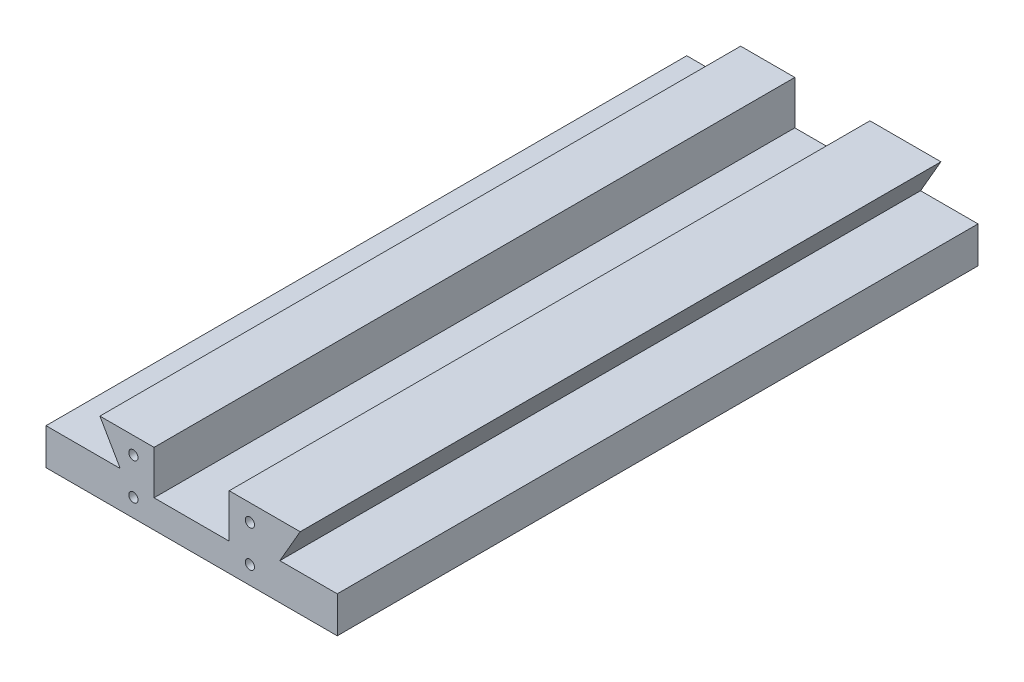
ISO-10303-21;
HEADER;
FILE_DESCRIPTION(('STEP AP214'),'2;1');
FILE_NAME('part.step','',(''),(''),'','','');
FILE_SCHEMA(('AUTOMOTIVE_DESIGN { 1 0 10303 214 1 1 1 1 }'));
ENDSEC;
DATA;
#1=APPLICATION_CONTEXT('core data for automotive mechanical design processes');
#2=APPLICATION_PROTOCOL_DEFINITION('international standard','automotive_design',2000,#1);
#3=PRODUCT_CONTEXT('',#1,'mechanical');
#4=PRODUCT('Part','Part','',(#3));
#5=PRODUCT_RELATED_PRODUCT_CATEGORY('part','',(#4));
#6=PRODUCT_DEFINITION_FORMATION('','',#4);
#7=PRODUCT_DEFINITION_CONTEXT('part definition',#1,'design');
#8=PRODUCT_DEFINITION('design','',#6,#7);
#9=PRODUCT_DEFINITION_SHAPE('','',#8);
#10=(LENGTH_UNIT() NAMED_UNIT(*) SI_UNIT(.MILLI.,.METRE.));
#11=(NAMED_UNIT(*) PLANE_ANGLE_UNIT() SI_UNIT($,.RADIAN.));
#12=(NAMED_UNIT(*) SI_UNIT($,.STERADIAN.) SOLID_ANGLE_UNIT());
#13=UNCERTAINTY_MEASURE_WITH_UNIT(LENGTH_MEASURE(1.E-05),#10,'distance_accuracy_value','');
#14=(GEOMETRIC_REPRESENTATION_CONTEXT(3) GLOBAL_UNCERTAINTY_ASSIGNED_CONTEXT((#13)) GLOBAL_UNIT_ASSIGNED_CONTEXT((#10,
#11,#12)) REPRESENTATION_CONTEXT('',''));
#15=CARTESIAN_POINT('',(0.,0.,0.));
#16=DIRECTION('',(0.,0.,1.));
#17=DIRECTION('',(1.,0.,0.));
#18=AXIS2_PLACEMENT_3D('',#15,#16,#17);
#19=CARTESIAN_POINT('',(0.,15.8750000000002,279.4));
#20=DIRECTION('',(0.,-1.,0.));
#21=DIRECTION('',(1.,0.,0.));
#22=AXIS2_PLACEMENT_3D('',#19,#20,#21);
#23=PLANE('',#22);
#24=DIRECTION('',(-1.,0.,0.));
#25=VECTOR('',#24,1.);
#26=CARTESIAN_POINT('',(0.,15.8750000000002,0.));
#27=LINE('',#26,#25);
#28=CARTESIAN_POINT('',(63.5,15.875,0.));
#29=VERTEX_POINT('',#28);
#30=CARTESIAN_POINT('',(38.4595644766147,15.8750000000001,0.));
#31=VERTEX_POINT('',#30);
#32=EDGE_CURVE('E165',#29,#31,#27,.T.);
#33=ORIENTED_EDGE('',*,*,#32,.T.);
#34=DIRECTION('',(0.,0.,-1.));
#35=VECTOR('',#34,1.);
#36=CARTESIAN_POINT('',(38.4595644766147,15.8750000000001,279.4));
#37=LINE('',#36,#35);
#38=CARTESIAN_POINT('',(38.4595644766147,15.8750000000001,279.4));
#39=VERTEX_POINT('',#38);
#40=EDGE_CURVE('E11',#39,#31,#37,.T.);
#41=ORIENTED_EDGE('',*,*,#40,.F.);
#42=DIRECTION('',(-1.,0.,0.));
#43=VECTOR('',#42,1.);
#44=CARTESIAN_POINT('',(0.,15.8750000000002,279.4));
#45=LINE('',#44,#43);
#46=CARTESIAN_POINT('',(63.5,15.875,279.4));
#47=VERTEX_POINT('',#46);
#48=EDGE_CURVE('E190',#47,#39,#45,.T.);
#49=ORIENTED_EDGE('',*,*,#48,.F.);
#50=DIRECTION('',(0.,0.,-1.));
#51=VECTOR('',#50,1.);
#52=CARTESIAN_POINT('',(63.5,15.875,279.4));
#53=LINE('',#52,#51);
#54=EDGE_CURVE('E161',#47,#29,#53,.T.);
#55=ORIENTED_EDGE('',*,*,#54,.T.);
#56=EDGE_LOOP('',(#33,#41,#49,#55));
#57=FACE_BOUND('',#56,.T.);
#58=ADVANCED_FACE('F41',(#57),#23,.F.);
#59=CARTESIAN_POINT('',(21.9705967149215,-12.684729927617,279.4));
#60=DIRECTION('',(-0.866025403784433,0.500000000000009,0.));
#61=DIRECTION('',(-0.500000000000009,-0.866025403784433,0.));
#62=AXIS2_PLACEMENT_3D('',#59,#60,#61);
#63=PLANE('',#62);
#64=DIRECTION('',(0.500000000000009,0.866025403784433,0.));
#65=VECTOR('',#64,1.);
#66=CARTESIAN_POINT('',(21.9705967149215,-12.684729927617,0.));
#67=LINE('',#66,#65);
#68=CARTESIAN_POINT('',(47.3317060632518,31.242,0.));
#69=VERTEX_POINT('',#68);
#70=EDGE_CURVE('E168',#31,#69,#67,.T.);
#71=ORIENTED_EDGE('',*,*,#70,.T.);
#72=DIRECTION('',(0.,0.,-1.));
#73=VECTOR('',#72,1.);
#74=CARTESIAN_POINT('',(47.3317060632518,31.242,279.4));
#75=LINE('',#74,#73);
#76=CARTESIAN_POINT('',(47.3317060632518,31.242,279.4));
#77=VERTEX_POINT('',#76);
#78=EDGE_CURVE('E49',#77,#69,#75,.T.);
#79=ORIENTED_EDGE('',*,*,#78,.F.);
#80=DIRECTION('',(0.500000000000009,0.866025403784433,0.));
#81=VECTOR('',#80,1.);
#82=CARTESIAN_POINT('',(21.9705967149215,-12.684729927617,279.4));
#83=LINE('',#82,#81);
#84=EDGE_CURVE('E113',#39,#77,#83,.T.);
#85=ORIENTED_EDGE('',*,*,#84,.F.);
#86=ORIENTED_EDGE('',*,*,#40,.T.);
#87=EDGE_LOOP('',(#71,#79,#85,#86));
#88=FACE_BOUND('',#87,.T.);
#89=ADVANCED_FACE('F264',(#88),#63,.F.);
#90=CARTESIAN_POINT('',(0.,31.242,279.4));
#91=DIRECTION('',(0.,-1.,0.));
#92=DIRECTION('',(1.,0.,0.));
#93=AXIS2_PLACEMENT_3D('',#90,#91,#92);
#94=PLANE('',#93);
#95=DIRECTION('',(-1.,0.,0.));
#96=VECTOR('',#95,1.);
#97=CARTESIAN_POINT('',(0.,31.242,0.));
#98=LINE('',#97,#96);
#99=CARTESIAN_POINT('',(16.383,31.242,0.));
#100=VERTEX_POINT('',#99);
#101=EDGE_CURVE('E171',#69,#100,#98,.T.);
#102=ORIENTED_EDGE('',*,*,#101,.T.);
#103=DIRECTION('',(0.,0.,-1.));
#104=VECTOR('',#103,1.);
#105=CARTESIAN_POINT('',(16.383,31.242,279.4));
#106=LINE('',#105,#104);
#107=CARTESIAN_POINT('',(16.383,31.242,279.4));
#108=VERTEX_POINT('',#107);
#109=EDGE_CURVE('E207',#108,#100,#106,.T.);
#110=ORIENTED_EDGE('',*,*,#109,.F.);
#111=DIRECTION('',(-1.,0.,0.));
#112=VECTOR('',#111,1.);
#113=CARTESIAN_POINT('',(0.,31.242,279.4));
#114=LINE('',#113,#112);
#115=EDGE_CURVE('E215',#77,#108,#114,.T.);
#116=ORIENTED_EDGE('',*,*,#115,.F.);
#117=ORIENTED_EDGE('',*,*,#78,.T.);
#118=EDGE_LOOP('',(#102,#110,#116,#117));
#119=FACE_BOUND('',#118,.T.);
#120=ADVANCED_FACE('F213',(#119),#94,.F.);
#121=CARTESIAN_POINT('',(16.383,0.,279.4));
#122=DIRECTION('',(1.,0.,0.));
#123=DIRECTION('',(0.,1.,0.));
#124=AXIS2_PLACEMENT_3D('',#121,#122,#123);
#125=PLANE('',#124);
#126=DIRECTION('',(0.,-1.,0.));
#127=VECTOR('',#126,1.);
#128=CARTESIAN_POINT('',(16.383,0.,0.));
#129=LINE('',#128,#127);
#130=CARTESIAN_POINT('',(16.383,12.192,0.));
#131=VERTEX_POINT('',#130);
#132=EDGE_CURVE('E173',#100,#131,#129,.T.);
#133=ORIENTED_EDGE('',*,*,#132,.T.);
#134=DIRECTION('',(0.,0.,-1.));
#135=VECTOR('',#134,1.);
#136=CARTESIAN_POINT('',(16.383,12.192,279.4));
#137=LINE('',#136,#135);
#138=CARTESIAN_POINT('',(16.383,12.192,279.4));
#139=VERTEX_POINT('',#138);
#140=EDGE_CURVE('E204',#139,#131,#137,.T.);
#141=ORIENTED_EDGE('',*,*,#140,.F.);
#142=DIRECTION('',(0.,-1.,0.));
#143=VECTOR('',#142,1.);
#144=CARTESIAN_POINT('',(16.383,0.,279.4));
#145=LINE('',#144,#143);
#146=EDGE_CURVE('E233',#108,#139,#145,.T.);
#147=ORIENTED_EDGE('',*,*,#146,.F.);
#148=ORIENTED_EDGE('',*,*,#109,.T.);
#149=EDGE_LOOP('',(#133,#141,#147,#148));
#150=FACE_BOUND('',#149,.T.);
#151=ADVANCED_FACE('F224',(#150),#125,.F.);
#152=CARTESIAN_POINT('',(0.,12.192,279.4));
#153=DIRECTION('',(0.,-1.,0.));
#154=DIRECTION('',(0.,0.,-1.));
#155=AXIS2_PLACEMENT_3D('',#152,#153,#154);
#156=PLANE('',#155);
#157=DIRECTION('',(-1.,0.,0.));
#158=VECTOR('',#157,1.);
#159=CARTESIAN_POINT('',(0.,12.192,0.));
#160=LINE('',#159,#158);
#161=CARTESIAN_POINT('',(-16.383,12.192,0.));
#162=VERTEX_POINT('',#161);
#163=EDGE_CURVE('E175',#131,#162,#160,.T.);
#164=ORIENTED_EDGE('',*,*,#163,.T.);
#165=DIRECTION('',(0.,0.,-1.));
#166=VECTOR('',#165,1.);
#167=CARTESIAN_POINT('',(-16.383,12.192,279.4));
#168=LINE('',#167,#166);
#169=CARTESIAN_POINT('',(-16.383,12.192,279.4));
#170=VERTEX_POINT('',#169);
#171=EDGE_CURVE('E201',#170,#162,#168,.T.);
#172=ORIENTED_EDGE('',*,*,#171,.F.);
#173=DIRECTION('',(-1.,0.,0.));
#174=VECTOR('',#173,1.);
#175=CARTESIAN_POINT('',(0.,12.192,279.4));
#176=LINE('',#175,#174);
#177=EDGE_CURVE('E230',#139,#170,#176,.T.);
#178=ORIENTED_EDGE('',*,*,#177,.F.);
#179=ORIENTED_EDGE('',*,*,#140,.T.);
#180=EDGE_LOOP('',(#164,#172,#178,#179));
#181=FACE_BOUND('',#180,.T.);
#182=ADVANCED_FACE('F228',(#181),#156,.F.);
#183=CARTESIAN_POINT('',(-16.383,0.,279.4));
#184=DIRECTION('',(-1.,0.,0.));
#185=DIRECTION('',(0.,-1.,0.));
#186=AXIS2_PLACEMENT_3D('',#183,#184,#185);
#187=PLANE('',#186);
#188=DIRECTION('',(0.,1.,0.));
#189=VECTOR('',#188,1.);
#190=CARTESIAN_POINT('',(-16.383,0.,0.));
#191=LINE('',#190,#189);
#192=CARTESIAN_POINT('',(-16.383,31.242,0.));
#193=VERTEX_POINT('',#192);
#194=EDGE_CURVE('E177',#162,#193,#191,.T.);
#195=ORIENTED_EDGE('',*,*,#194,.T.);
#196=DIRECTION('',(0.,0.,-1.));
#197=VECTOR('',#196,1.);
#198=CARTESIAN_POINT('',(-16.383,31.242,279.4));
#199=LINE('',#198,#197);
#200=CARTESIAN_POINT('',(-16.383,31.242,279.4));
#201=VERTEX_POINT('',#200);
#202=EDGE_CURVE('E198',#201,#193,#199,.T.);
#203=ORIENTED_EDGE('',*,*,#202,.F.);
#204=DIRECTION('',(0.,1.,0.));
#205=VECTOR('',#204,1.);
#206=CARTESIAN_POINT('',(-16.383,0.,279.4));
#207=LINE('',#206,#205);
#208=EDGE_CURVE('E232',#170,#201,#207,.T.);
#209=ORIENTED_EDGE('',*,*,#208,.F.);
#210=ORIENTED_EDGE('',*,*,#171,.T.);
#211=EDGE_LOOP('',(#195,#203,#209,#210));
#212=FACE_BOUND('',#211,.T.);
#213=ADVANCED_FACE('F604',(#212),#187,.F.);
#214=CARTESIAN_POINT('',(0.,31.242,279.4));
#215=DIRECTION('',(0.,-1.,0.));
#216=DIRECTION('',(1.,0.,0.));
#217=AXIS2_PLACEMENT_3D('',#214,#215,#216);
#218=PLANE('',#217);
#219=DIRECTION('',(-1.,0.,0.));
#220=VECTOR('',#219,1.);
#221=CARTESIAN_POINT('',(0.,31.242,0.));
#222=LINE('',#221,#220);
#223=CARTESIAN_POINT('',(-39.999357644543,31.242,0.));
#224=VERTEX_POINT('',#223);
#225=EDGE_CURVE('E179',#193,#224,#222,.T.);
#226=ORIENTED_EDGE('',*,*,#225,.T.);
#227=DIRECTION('',(0.,0.,-1.));
#228=VECTOR('',#227,1.);
#229=CARTESIAN_POINT('',(-39.999357644543,31.242,279.4));
#230=LINE('',#229,#228);
#231=CARTESIAN_POINT('',(-39.999357644543,31.242,279.4));
#232=VERTEX_POINT('',#231);
#233=EDGE_CURVE('E196',#232,#224,#230,.T.);
#234=ORIENTED_EDGE('',*,*,#233,.F.);
#235=DIRECTION('',(-1.,0.,0.));
#236=VECTOR('',#235,1.);
#237=CARTESIAN_POINT('',(0.,31.242,279.4));
#238=LINE('',#237,#236);
#239=EDGE_CURVE('E235',#201,#232,#238,.T.);
#240=ORIENTED_EDGE('',*,*,#239,.F.);
#241=ORIENTED_EDGE('',*,*,#202,.T.);
#242=EDGE_LOOP('',(#226,#234,#240,#241));
#243=FACE_BOUND('',#242,.T.);
#244=ADVANCED_FACE('F250',(#243),#218,.F.);
#245=CARTESIAN_POINT('',(-16.4713354008906,-9.50972992761677,279.4));
#246=DIRECTION('',(-0.86602540378444,-0.499999999999998,0.));
#247=DIRECTION('',(0.499999999999998,-0.86602540378444,0.));
#248=AXIS2_PLACEMENT_3D('',#245,#246,#247);
#249=PLANE('',#248);
#250=DIRECTION('',(-0.499999999999998,0.86602540378444,0.));
#251=VECTOR('',#250,1.);
#252=CARTESIAN_POINT('',(-16.4713354008906,-9.50972992761677,0.));
#253=LINE('',#252,#251);
#254=CARTESIAN_POINT('',(-31.1272160579063,15.8750000000005,0.));
#255=VERTEX_POINT('',#254);
#256=EDGE_CURVE('E182',#255,#224,#253,.T.);
#257=ORIENTED_EDGE('',*,*,#256,.F.);
#258=DIRECTION('',(0.,0.,-1.));
#259=VECTOR('',#258,1.);
#260=CARTESIAN_POINT('',(-31.1272160579063,15.8750000000005,279.4));
#261=LINE('',#260,#259);
#262=CARTESIAN_POINT('',(-31.1272160579063,15.8750000000005,279.4));
#263=VERTEX_POINT('',#262);
#264=EDGE_CURVE('E194',#263,#255,#261,.T.);
#265=ORIENTED_EDGE('',*,*,#264,.F.);
#266=DIRECTION('',(-0.499999999999998,0.86602540378444,0.));
#267=VECTOR('',#266,1.);
#268=CARTESIAN_POINT('',(-16.4713354008906,-9.50972992761677,279.4));
#269=LINE('',#268,#267);
#270=EDGE_CURVE('E241',#263,#232,#269,.T.);
#271=ORIENTED_EDGE('',*,*,#270,.T.);
#272=ORIENTED_EDGE('',*,*,#233,.T.);
#273=EDGE_LOOP('',(#257,#265,#271,#272));
#274=FACE_BOUND('',#273,.T.);
#275=ADVANCED_FACE('F245',(#274),#249,.T.);
#276=CARTESIAN_POINT('',(-2.36487797714563E-13,15.875000000001,279.4));
#277=DIRECTION('',(0.,-1.,0.));
#278=DIRECTION('',(1.,0.,0.));
#279=AXIS2_PLACEMENT_3D('',#276,#277,#278);
#280=PLANE('',#279);
#281=DIRECTION('',(-1.,0.,0.));
#282=VECTOR('',#281,1.);
#283=CARTESIAN_POINT('',(-2.36487797714563E-13,15.875000000001,0.));
#284=LINE('',#283,#282);
#285=CARTESIAN_POINT('',(-63.5,15.875,0.));
#286=VERTEX_POINT('',#285);
#287=EDGE_CURVE('E185',#255,#286,#284,.T.);
#288=ORIENTED_EDGE('',*,*,#287,.T.);
#289=DIRECTION('',(0.,0.,-1.));
#290=VECTOR('',#289,1.);
#291=CARTESIAN_POINT('',(-63.5,15.875,279.4));
#292=LINE('',#291,#290);
#293=CARTESIAN_POINT('',(-63.5,15.875,279.4));
#294=VERTEX_POINT('',#293);
#295=EDGE_CURVE('E156',#294,#286,#292,.T.);
#296=ORIENTED_EDGE('',*,*,#295,.F.);
#297=DIRECTION('',(-1.,0.,0.));
#298=VECTOR('',#297,1.);
#299=CARTESIAN_POINT('',(-2.36487797714563E-13,15.875000000001,279.4));
#300=LINE('',#299,#298);
#301=EDGE_CURVE('E147',#263,#294,#300,.T.);
#302=ORIENTED_EDGE('',*,*,#301,.F.);
#303=ORIENTED_EDGE('',*,*,#264,.T.);
#304=EDGE_LOOP('',(#288,#296,#302,#303));
#305=FACE_BOUND('',#304,.T.);
#306=ADVANCED_FACE('F254',(#305),#280,.F.);
#307=CARTESIAN_POINT('',(-63.5,0.,279.4));
#308=DIRECTION('',(1.,0.,0.));
#309=DIRECTION('',(0.,0.,-1.));
#310=AXIS2_PLACEMENT_3D('',#307,#308,#309);
#311=PLANE('',#310);
#312=DIRECTION('',(0.,-1.,0.));
#313=VECTOR('',#312,1.);
#314=CARTESIAN_POINT('',(-63.5,0.,0.));
#315=LINE('',#314,#313);
#316=CARTESIAN_POINT('',(-63.5,0.,0.));
#317=VERTEX_POINT('',#316);
#318=EDGE_CURVE('E155',#286,#317,#315,.T.);
#319=ORIENTED_EDGE('',*,*,#318,.T.);
#320=DIRECTION('',(0.,0.,-1.));
#321=VECTOR('',#320,1.);
#322=CARTESIAN_POINT('',(-63.5,0.,279.4));
#323=LINE('',#322,#321);
#324=CARTESIAN_POINT('',(-63.5,0.,279.4));
#325=VERTEX_POINT('',#324);
#326=EDGE_CURVE('E152',#325,#317,#323,.T.);
#327=ORIENTED_EDGE('',*,*,#326,.F.);
#328=DIRECTION('',(0.,-1.,0.));
#329=VECTOR('',#328,1.);
#330=CARTESIAN_POINT('',(-63.5,0.,279.4));
#331=LINE('',#330,#329);
#332=EDGE_CURVE('E140',#294,#325,#331,.T.);
#333=ORIENTED_EDGE('',*,*,#332,.F.);
#334=ORIENTED_EDGE('',*,*,#295,.T.);
#335=EDGE_LOOP('',(#319,#327,#333,#334));
#336=FACE_BOUND('',#335,.T.);
#337=ADVANCED_FACE('F153',(#336),#311,.F.);
#338=CARTESIAN_POINT('',(0.,0.,279.4));
#339=DIRECTION('',(0.,1.,0.));
#340=DIRECTION('',(0.,0.,1.));
#341=AXIS2_PLACEMENT_3D('',#338,#339,#340);
#342=PLANE('',#341);
#343=DIRECTION('',(1.,0.,0.));
#344=VECTOR('',#343,1.);
#345=CARTESIAN_POINT('',(0.,0.,0.));
#346=LINE('',#345,#344);
#347=CARTESIAN_POINT('',(63.5,0.,0.));
#348=VERTEX_POINT('',#347);
#349=EDGE_CURVE('E99',#317,#348,#346,.T.);
#350=ORIENTED_EDGE('',*,*,#349,.T.);
#351=DIRECTION('',(0.,0.,-1.));
#352=VECTOR('',#351,1.);
#353=CARTESIAN_POINT('',(63.5,0.,279.4));
#354=LINE('',#353,#352);
#355=CARTESIAN_POINT('',(63.5,0.,279.4));
#356=VERTEX_POINT('',#355);
#357=EDGE_CURVE('E157',#356,#348,#354,.T.);
#358=ORIENTED_EDGE('',*,*,#357,.F.);
#359=DIRECTION('',(1.,0.,0.));
#360=VECTOR('',#359,1.);
#361=CARTESIAN_POINT('',(0.,0.,279.4));
#362=LINE('',#361,#360);
#363=EDGE_CURVE('E144',#325,#356,#362,.T.);
#364=ORIENTED_EDGE('',*,*,#363,.F.);
#365=ORIENTED_EDGE('',*,*,#326,.T.);
#366=EDGE_LOOP('',(#350,#358,#364,#365));
#367=FACE_BOUND('',#366,.T.);
#368=ADVANCED_FACE('F159',(#367),#342,.F.);
#369=CARTESIAN_POINT('',(63.5,0.,279.4));
#370=DIRECTION('',(-1.,0.,0.));
#371=DIRECTION('',(0.,-1.,0.));
#372=AXIS2_PLACEMENT_3D('',#369,#370,#371);
#373=PLANE('',#372);
#374=DIRECTION('',(0.,1.,0.));
#375=VECTOR('',#374,1.);
#376=CARTESIAN_POINT('',(63.5,0.,0.));
#377=LINE('',#376,#375);
#378=EDGE_CURVE('E105',#348,#29,#377,.T.);
#379=ORIENTED_EDGE('',*,*,#378,.T.);
#380=ORIENTED_EDGE('',*,*,#54,.F.);
#381=DIRECTION('',(0.,1.,0.));
#382=VECTOR('',#381,1.);
#383=CARTESIAN_POINT('',(63.5,0.,279.4));
#384=LINE('',#383,#382);
#385=EDGE_CURVE('E57',#356,#47,#384,.T.);
#386=ORIENTED_EDGE('',*,*,#385,.F.);
#387=ORIENTED_EDGE('',*,*,#357,.T.);
#388=EDGE_LOOP('',(#379,#380,#386,#387));
#389=FACE_BOUND('',#388,.T.);
#390=ADVANCED_FACE('F271',(#389),#373,.F.);
#391=CARTESIAN_POINT('',(0.,0.,279.4));
#392=DIRECTION('',(0.,0.,1.));
#393=DIRECTION('',(1.,0.,0.));
#394=AXIS2_PLACEMENT_3D('',#391,#392,#393);
#395=PLANE('',#394);
#396=CARTESIAN_POINT('',(25.4,23.8125,279.4));
#397=DIRECTION('',(0.,0.,1.));
#398=DIRECTION('',(1.,0.,0.));
#399=AXIS2_PLACEMENT_3D('',#396,#397,#398);
#400=CIRCLE('',#399,2.0193);
#401=CARTESIAN_POINT('',(27.4193,23.8125,279.4));
#402=VERTEX_POINT('',#401);
#403=EDGE_CURVE('E356',#402,#402,#400,.T.);
#404=ORIENTED_EDGE('',*,*,#403,.F.);
#405=EDGE_LOOP('',(#404));
#406=FACE_BOUND('',#405,.T.);
#407=CARTESIAN_POINT('',(25.4,7.874,279.4));
#408=DIRECTION('',(0.,0.,1.));
#409=DIRECTION('',(1.,0.,0.));
#410=AXIS2_PLACEMENT_3D('',#407,#408,#409);
#411=CIRCLE('',#410,2.0193);
#412=CARTESIAN_POINT('',(27.4193,7.874,279.4));
#413=VERTEX_POINT('',#412);
#414=EDGE_CURVE('E358',#413,#413,#411,.T.);
#415=ORIENTED_EDGE('',*,*,#414,.F.);
#416=EDGE_LOOP('',(#415));
#417=FACE_BOUND('',#416,.T.);
#418=CARTESIAN_POINT('',(-25.4,7.874,279.4));
#419=DIRECTION('',(0.,0.,1.));
#420=DIRECTION('',(1.,0.,0.));
#421=AXIS2_PLACEMENT_3D('',#418,#419,#420);
#422=CIRCLE('',#421,2.0193);
#423=CARTESIAN_POINT('',(-23.3807,7.874,279.4));
#424=VERTEX_POINT('',#423);
#425=EDGE_CURVE('E366',#424,#424,#422,.T.);
#426=ORIENTED_EDGE('',*,*,#425,.F.);
#427=EDGE_LOOP('',(#426));
#428=FACE_BOUND('',#427,.T.);
#429=CARTESIAN_POINT('',(-25.4,23.8125,279.4));
#430=DIRECTION('',(0.,0.,1.));
#431=DIRECTION('',(1.,0.,0.));
#432=AXIS2_PLACEMENT_3D('',#429,#430,#431);
#433=CIRCLE('',#432,2.0193);
#434=CARTESIAN_POINT('',(-23.3807,23.8125,279.4));
#435=VERTEX_POINT('',#434);
#436=EDGE_CURVE('E372',#435,#435,#433,.T.);
#437=ORIENTED_EDGE('',*,*,#436,.F.);
#438=EDGE_LOOP('',(#437));
#439=FACE_BOUND('',#438,.T.);
#440=ORIENTED_EDGE('',*,*,#48,.T.);
#441=ORIENTED_EDGE('',*,*,#84,.T.);
#442=ORIENTED_EDGE('',*,*,#115,.T.);
#443=ORIENTED_EDGE('',*,*,#146,.T.);
#444=ORIENTED_EDGE('',*,*,#177,.T.);
#445=ORIENTED_EDGE('',*,*,#208,.T.);
#446=ORIENTED_EDGE('',*,*,#239,.T.);
#447=ORIENTED_EDGE('',*,*,#270,.F.);
#448=ORIENTED_EDGE('',*,*,#301,.T.);
#449=ORIENTED_EDGE('',*,*,#332,.T.);
#450=ORIENTED_EDGE('',*,*,#363,.T.);
#451=ORIENTED_EDGE('',*,*,#385,.T.);
#452=EDGE_LOOP('',(#440,#441,#442,#443,#444,#445,#446,#447,#448,#449,#450,#451));
#453=FACE_BOUND('',#452,.T.);
#454=ADVANCED_FACE('F142',(#406,#417,#428,#439,#453),#395,.T.);
#455=CARTESIAN_POINT('',(0.,0.,0.));
#456=DIRECTION('',(0.,0.,1.));
#457=DIRECTION('',(1.,0.,0.));
#458=AXIS2_PLACEMENT_3D('',#455,#456,#457);
#459=PLANE('',#458);
#460=CARTESIAN_POINT('',(25.4,23.8125,0.));
#461=DIRECTION('',(0.,0.,-1.));
#462=DIRECTION('',(-1.,0.,0.));
#463=AXIS2_PLACEMENT_3D('',#460,#461,#462);
#464=CIRCLE('',#463,2.0193);
#465=CARTESIAN_POINT('',(23.3807,23.8125,0.));
#466=VERTEX_POINT('',#465);
#467=EDGE_CURVE('E378',#466,#466,#464,.T.);
#468=ORIENTED_EDGE('',*,*,#467,.F.);
#469=EDGE_LOOP('',(#468));
#470=FACE_BOUND('',#469,.T.);
#471=CARTESIAN_POINT('',(-25.4,23.8125,0.));
#472=DIRECTION('',(0.,0.,-1.));
#473=DIRECTION('',(-1.,0.,0.));
#474=AXIS2_PLACEMENT_3D('',#471,#472,#473);
#475=CIRCLE('',#474,2.0193);
#476=CARTESIAN_POINT('',(-27.4193,23.8125,0.));
#477=VERTEX_POINT('',#476);
#478=EDGE_CURVE('E384',#477,#477,#475,.T.);
#479=ORIENTED_EDGE('',*,*,#478,.F.);
#480=EDGE_LOOP('',(#479));
#481=FACE_BOUND('',#480,.T.);
#482=CARTESIAN_POINT('',(-25.4,7.874,0.));
#483=DIRECTION('',(0.,0.,-1.));
#484=DIRECTION('',(-1.,0.,0.));
#485=AXIS2_PLACEMENT_3D('',#482,#483,#484);
#486=CIRCLE('',#485,2.0193);
#487=CARTESIAN_POINT('',(-27.4193,7.874,0.));
#488=VERTEX_POINT('',#487);
#489=EDGE_CURVE('E390',#488,#488,#486,.T.);
#490=ORIENTED_EDGE('',*,*,#489,.F.);
#491=EDGE_LOOP('',(#490));
#492=FACE_BOUND('',#491,.T.);
#493=CARTESIAN_POINT('',(25.4,7.874,0.));
#494=DIRECTION('',(0.,0.,-1.));
#495=DIRECTION('',(-1.,0.,0.));
#496=AXIS2_PLACEMENT_3D('',#493,#494,#495);
#497=CIRCLE('',#496,2.0193);
#498=CARTESIAN_POINT('',(23.3807,7.874,0.));
#499=VERTEX_POINT('',#498);
#500=EDGE_CURVE('E396',#499,#499,#497,.T.);
#501=ORIENTED_EDGE('',*,*,#500,.F.);
#502=EDGE_LOOP('',(#501));
#503=FACE_BOUND('',#502,.T.);
#504=ORIENTED_EDGE('',*,*,#32,.F.);
#505=ORIENTED_EDGE('',*,*,#378,.F.);
#506=ORIENTED_EDGE('',*,*,#349,.F.);
#507=ORIENTED_EDGE('',*,*,#318,.F.);
#508=ORIENTED_EDGE('',*,*,#287,.F.);
#509=ORIENTED_EDGE('',*,*,#256,.T.);
#510=ORIENTED_EDGE('',*,*,#225,.F.);
#511=ORIENTED_EDGE('',*,*,#194,.F.);
#512=ORIENTED_EDGE('',*,*,#163,.F.);
#513=ORIENTED_EDGE('',*,*,#132,.F.);
#514=ORIENTED_EDGE('',*,*,#101,.F.);
#515=ORIENTED_EDGE('',*,*,#70,.F.);
#516=EDGE_LOOP('',(#504,#505,#506,#507,#508,#509,#510,#511,#512,#513,#514,#515));
#517=FACE_BOUND('',#516,.T.);
#518=ADVANCED_FACE('F219',(#470,#481,#492,#503,#517),#459,.F.);
#519=CARTESIAN_POINT('',(25.4,7.874,11.938));
#520=DIRECTION('',(0.,0.,-1.));
#521=DIRECTION('',(-1.,0.,0.));
#522=AXIS2_PLACEMENT_3D('',#519,#520,#521);
#523=CONICAL_SURFACE('',#522,2.01929999999999,1.02974425867665);
#524=CARTESIAN_POINT('',(25.4,7.874,13.1513178480023));
#525=VERTEX_POINT('',#524);
#526=VERTEX_LOOP('',#525);
#527=FACE_BOUND('',#526,.T.);
#528=CARTESIAN_POINT('',(25.4,7.874,11.938));
#529=DIRECTION('',(0.,0.,-1.));
#530=DIRECTION('',(-1.,0.,0.));
#531=AXIS2_PLACEMENT_3D('',#528,#529,#530);
#532=CIRCLE('',#531,2.01929999999999);
#533=CARTESIAN_POINT('',(23.3807,7.874,11.938));
#534=VERTEX_POINT('',#533);
#535=EDGE_CURVE('E169',#534,#534,#532,.T.);
#536=ORIENTED_EDGE('',*,*,#535,.T.);
#537=EDGE_LOOP('',(#536));
#538=FACE_BOUND('',#537,.T.);
#539=ADVANCED_FACE('F283',(#527,#538),#523,.F.);
#540=CARTESIAN_POINT('',(25.4,7.874,0.));
#541=DIRECTION('',(0.,0.,-1.));
#542=DIRECTION('',(-1.,0.,0.));
#543=AXIS2_PLACEMENT_3D('',#540,#541,#542);
#544=CYLINDRICAL_SURFACE('',#543,2.0193);
#545=ORIENTED_EDGE('',*,*,#535,.F.);
#546=EDGE_LOOP('',(#545));
#547=FACE_BOUND('',#546,.T.);
#548=ORIENTED_EDGE('',*,*,#500,.T.);
#549=EDGE_LOOP('',(#548));
#550=FACE_BOUND('',#549,.T.);
#551=ADVANCED_FACE('F288',(#547,#550),#544,.F.);
#552=CARTESIAN_POINT('',(-25.4,7.874,11.938));
#553=DIRECTION('',(0.,0.,-1.));
#554=DIRECTION('',(-1.,0.,0.));
#555=AXIS2_PLACEMENT_3D('',#552,#553,#554);
#556=CONICAL_SURFACE('',#555,2.01929999999999,1.02974425867665);
#557=CARTESIAN_POINT('',(-25.4,7.874,13.1513178480023));
#558=VERTEX_POINT('',#557);
#559=VERTEX_LOOP('',#558);
#560=FACE_BOUND('',#559,.T.);
#561=CARTESIAN_POINT('',(-25.4,7.874,11.938));
#562=DIRECTION('',(0.,0.,-1.));
#563=DIRECTION('',(-1.,0.,0.));
#564=AXIS2_PLACEMENT_3D('',#561,#562,#563);
#565=CIRCLE('',#564,2.01929999999999);
#566=CARTESIAN_POINT('',(-27.4193,7.874,11.938));
#567=VERTEX_POINT('',#566);
#568=EDGE_CURVE('E393',#567,#567,#565,.T.);
#569=ORIENTED_EDGE('',*,*,#568,.T.);
#570=EDGE_LOOP('',(#569));
#571=FACE_BOUND('',#570,.T.);
#572=ADVANCED_FACE('F292',(#560,#571),#556,.F.);
#573=CARTESIAN_POINT('',(-25.4,7.874,0.));
#574=DIRECTION('',(0.,0.,-1.));
#575=DIRECTION('',(-1.,0.,0.));
#576=AXIS2_PLACEMENT_3D('',#573,#574,#575);
#577=CYLINDRICAL_SURFACE('',#576,2.0193);
#578=ORIENTED_EDGE('',*,*,#568,.F.);
#579=EDGE_LOOP('',(#578));
#580=FACE_BOUND('',#579,.T.);
#581=ORIENTED_EDGE('',*,*,#489,.T.);
#582=EDGE_LOOP('',(#581));
#583=FACE_BOUND('',#582,.T.);
#584=ADVANCED_FACE('F296',(#580,#583),#577,.F.);
#585=CARTESIAN_POINT('',(-25.4,23.8125,11.938));
#586=DIRECTION('',(0.,0.,-1.));
#587=DIRECTION('',(-1.,0.,0.));
#588=AXIS2_PLACEMENT_3D('',#585,#586,#587);
#589=CONICAL_SURFACE('',#588,2.01929999999999,1.02974425867665);
#590=CARTESIAN_POINT('',(-25.4,23.8125,13.1513178480023));
#591=VERTEX_POINT('',#590);
#592=VERTEX_LOOP('',#591);
#593=FACE_BOUND('',#592,.T.);
#594=CARTESIAN_POINT('',(-25.4,23.8125,11.938));
#595=DIRECTION('',(0.,0.,-1.));
#596=DIRECTION('',(-1.,0.,0.));
#597=AXIS2_PLACEMENT_3D('',#594,#595,#596);
#598=CIRCLE('',#597,2.01929999999999);
#599=CARTESIAN_POINT('',(-27.4193,23.8125,11.938));
#600=VERTEX_POINT('',#599);
#601=EDGE_CURVE('E387',#600,#600,#598,.T.);
#602=ORIENTED_EDGE('',*,*,#601,.T.);
#603=EDGE_LOOP('',(#602));
#604=FACE_BOUND('',#603,.T.);
#605=ADVANCED_FACE('F300',(#593,#604),#589,.F.);
#606=CARTESIAN_POINT('',(-25.4,23.8125,0.));
#607=DIRECTION('',(0.,0.,-1.));
#608=DIRECTION('',(-1.,0.,0.));
#609=AXIS2_PLACEMENT_3D('',#606,#607,#608);
#610=CYLINDRICAL_SURFACE('',#609,2.0193);
#611=ORIENTED_EDGE('',*,*,#601,.F.);
#612=EDGE_LOOP('',(#611));
#613=FACE_BOUND('',#612,.T.);
#614=ORIENTED_EDGE('',*,*,#478,.T.);
#615=EDGE_LOOP('',(#614));
#616=FACE_BOUND('',#615,.T.);
#617=ADVANCED_FACE('F304',(#613,#616),#610,.F.);
#618=CARTESIAN_POINT('',(25.4,23.8125,11.938));
#619=DIRECTION('',(0.,0.,-1.));
#620=DIRECTION('',(-1.,0.,0.));
#621=AXIS2_PLACEMENT_3D('',#618,#619,#620);
#622=CONICAL_SURFACE('',#621,2.01929999999999,1.02974425867665);
#623=CARTESIAN_POINT('',(25.4,23.8125,13.1513178480023));
#624=VERTEX_POINT('',#623);
#625=VERTEX_LOOP('',#624);
#626=FACE_BOUND('',#625,.T.);
#627=CARTESIAN_POINT('',(25.4,23.8125,11.938));
#628=DIRECTION('',(0.,0.,-1.));
#629=DIRECTION('',(-1.,0.,0.));
#630=AXIS2_PLACEMENT_3D('',#627,#628,#629);
#631=CIRCLE('',#630,2.01929999999999);
#632=CARTESIAN_POINT('',(23.3807,23.8125,11.938));
#633=VERTEX_POINT('',#632);
#634=EDGE_CURVE('E381',#633,#633,#631,.T.);
#635=ORIENTED_EDGE('',*,*,#634,.T.);
#636=EDGE_LOOP('',(#635));
#637=FACE_BOUND('',#636,.T.);
#638=ADVANCED_FACE('F308',(#626,#637),#622,.F.);
#639=CARTESIAN_POINT('',(25.4,23.8125,0.));
#640=DIRECTION('',(0.,0.,-1.));
#641=DIRECTION('',(-1.,0.,0.));
#642=AXIS2_PLACEMENT_3D('',#639,#640,#641);
#643=CYLINDRICAL_SURFACE('',#642,2.0193);
#644=ORIENTED_EDGE('',*,*,#634,.F.);
#645=EDGE_LOOP('',(#644));
#646=FACE_BOUND('',#645,.T.);
#647=ORIENTED_EDGE('',*,*,#467,.T.);
#648=EDGE_LOOP('',(#647));
#649=FACE_BOUND('',#648,.T.);
#650=ADVANCED_FACE('F312',(#646,#649),#643,.F.);
#651=CARTESIAN_POINT('',(-25.4,23.8125,267.462));
#652=DIRECTION('',(0.,0.,1.));
#653=DIRECTION('',(1.,0.,0.));
#654=AXIS2_PLACEMENT_3D('',#651,#652,#653);
#655=CONICAL_SURFACE('',#654,2.01929999999999,1.02974425867666);
#656=CARTESIAN_POINT('',(-25.4,23.8125,266.248682151998));
#657=VERTEX_POINT('',#656);
#658=VERTEX_LOOP('',#657);
#659=FACE_BOUND('',#658,.T.);
#660=CARTESIAN_POINT('',(-25.4,23.8125,267.462));
#661=DIRECTION('',(0.,0.,1.));
#662=DIRECTION('',(1.,0.,0.));
#663=AXIS2_PLACEMENT_3D('',#660,#661,#662);
#664=CIRCLE('',#663,2.01929999999999);
#665=CARTESIAN_POINT('',(-23.3807,23.8125,267.462));
#666=VERTEX_POINT('',#665);
#667=EDGE_CURVE('E375',#666,#666,#664,.T.);
#668=ORIENTED_EDGE('',*,*,#667,.T.);
#669=EDGE_LOOP('',(#668));
#670=FACE_BOUND('',#669,.T.);
#671=ADVANCED_FACE('F316',(#659,#670),#655,.F.);
#672=CARTESIAN_POINT('',(-25.4,23.8125,279.4));
#673=DIRECTION('',(0.,0.,1.));
#674=DIRECTION('',(1.,0.,0.));
#675=AXIS2_PLACEMENT_3D('',#672,#673,#674);
#676=CYLINDRICAL_SURFACE('',#675,2.0193);
#677=ORIENTED_EDGE('',*,*,#667,.F.);
#678=EDGE_LOOP('',(#677));
#679=FACE_BOUND('',#678,.T.);
#680=ORIENTED_EDGE('',*,*,#436,.T.);
#681=EDGE_LOOP('',(#680));
#682=FACE_BOUND('',#681,.T.);
#683=ADVANCED_FACE('F320',(#679,#682),#676,.F.);
#684=CARTESIAN_POINT('',(-25.4,7.874,267.462));
#685=DIRECTION('',(0.,0.,1.));
#686=DIRECTION('',(1.,0.,0.));
#687=AXIS2_PLACEMENT_3D('',#684,#685,#686);
#688=CONICAL_SURFACE('',#687,2.01929999999999,1.02974425867666);
#689=CARTESIAN_POINT('',(-25.4,7.874,266.248682151998));
#690=VERTEX_POINT('',#689);
#691=VERTEX_LOOP('',#690);
#692=FACE_BOUND('',#691,.T.);
#693=CARTESIAN_POINT('',(-25.4,7.874,267.462));
#694=DIRECTION('',(0.,0.,1.));
#695=DIRECTION('',(1.,0.,0.));
#696=AXIS2_PLACEMENT_3D('',#693,#694,#695);
#697=CIRCLE('',#696,2.01929999999999);
#698=CARTESIAN_POINT('',(-23.3807,7.874,267.462));
#699=VERTEX_POINT('',#698);
#700=EDGE_CURVE('E369',#699,#699,#697,.T.);
#701=ORIENTED_EDGE('',*,*,#700,.T.);
#702=EDGE_LOOP('',(#701));
#703=FACE_BOUND('',#702,.T.);
#704=ADVANCED_FACE('F324',(#692,#703),#688,.F.);
#705=CARTESIAN_POINT('',(-25.4,7.874,279.4));
#706=DIRECTION('',(0.,0.,1.));
#707=DIRECTION('',(1.,0.,0.));
#708=AXIS2_PLACEMENT_3D('',#705,#706,#707);
#709=CYLINDRICAL_SURFACE('',#708,2.0193);
#710=ORIENTED_EDGE('',*,*,#700,.F.);
#711=EDGE_LOOP('',(#710));
#712=FACE_BOUND('',#711,.T.);
#713=ORIENTED_EDGE('',*,*,#425,.T.);
#714=EDGE_LOOP('',(#713));
#715=FACE_BOUND('',#714,.T.);
#716=ADVANCED_FACE('F328',(#712,#715),#709,.F.);
#717=CARTESIAN_POINT('',(25.4,7.874,267.462));
#718=DIRECTION('',(0.,0.,1.));
#719=DIRECTION('',(1.,0.,0.));
#720=AXIS2_PLACEMENT_3D('',#717,#718,#719);
#721=CONICAL_SURFACE('',#720,2.01929999999999,1.02974425867666);
#722=CARTESIAN_POINT('',(25.4,7.874,266.248682151998));
#723=VERTEX_POINT('',#722);
#724=VERTEX_LOOP('',#723);
#725=FACE_BOUND('',#724,.T.);
#726=CARTESIAN_POINT('',(25.4,7.874,267.462));
#727=DIRECTION('',(0.,0.,1.));
#728=DIRECTION('',(1.,0.,0.));
#729=AXIS2_PLACEMENT_3D('',#726,#727,#728);
#730=CIRCLE('',#729,2.01929999999999);
#731=CARTESIAN_POINT('',(27.4193,7.874,267.462));
#732=VERTEX_POINT('',#731);
#733=EDGE_CURVE('E363',#732,#732,#730,.T.);
#734=ORIENTED_EDGE('',*,*,#733,.T.);
#735=EDGE_LOOP('',(#734));
#736=FACE_BOUND('',#735,.T.);
#737=ADVANCED_FACE('F332',(#725,#736),#721,.F.);
#738=CARTESIAN_POINT('',(25.4,7.874,279.4));
#739=DIRECTION('',(0.,0.,1.));
#740=DIRECTION('',(1.,0.,0.));
#741=AXIS2_PLACEMENT_3D('',#738,#739,#740);
#742=CYLINDRICAL_SURFACE('',#741,2.0193);
#743=ORIENTED_EDGE('',*,*,#733,.F.);
#744=EDGE_LOOP('',(#743));
#745=FACE_BOUND('',#744,.T.);
#746=ORIENTED_EDGE('',*,*,#414,.T.);
#747=EDGE_LOOP('',(#746));
#748=FACE_BOUND('',#747,.T.);
#749=ADVANCED_FACE('F336',(#745,#748),#742,.F.);
#750=CARTESIAN_POINT('',(25.4,23.8125,267.462));
#751=DIRECTION('',(0.,0.,1.));
#752=DIRECTION('',(1.,0.,0.));
#753=AXIS2_PLACEMENT_3D('',#750,#751,#752);
#754=CONICAL_SURFACE('',#753,2.01929999999999,1.02974425867666);
#755=CARTESIAN_POINT('',(25.4,23.8125,266.248682151998));
#756=VERTEX_POINT('',#755);
#757=VERTEX_LOOP('',#756);
#758=FACE_BOUND('',#757,.T.);
#759=CARTESIAN_POINT('',(25.4,23.8125,267.462));
#760=DIRECTION('',(0.,0.,1.));
#761=DIRECTION('',(1.,0.,0.));
#762=AXIS2_PLACEMENT_3D('',#759,#760,#761);
#763=CIRCLE('',#762,2.01929999999999);
#764=CARTESIAN_POINT('',(27.4193,23.8125,267.462));
#765=VERTEX_POINT('',#764);
#766=EDGE_CURVE('E353',#765,#765,#763,.T.);
#767=ORIENTED_EDGE('',*,*,#766,.T.);
#768=EDGE_LOOP('',(#767));
#769=FACE_BOUND('',#768,.T.);
#770=ADVANCED_FACE('F340',(#758,#769),#754,.F.);
#771=CARTESIAN_POINT('',(25.4,23.8125,279.4));
#772=DIRECTION('',(0.,0.,1.));
#773=DIRECTION('',(1.,0.,0.));
#774=AXIS2_PLACEMENT_3D('',#771,#772,#773);
#775=CYLINDRICAL_SURFACE('',#774,2.0193);
#776=ORIENTED_EDGE('',*,*,#766,.F.);
#777=EDGE_LOOP('',(#776));
#778=FACE_BOUND('',#777,.T.);
#779=ORIENTED_EDGE('',*,*,#403,.T.);
#780=EDGE_LOOP('',(#779));
#781=FACE_BOUND('',#780,.T.);
#782=ADVANCED_FACE('F344',(#778,#781),#775,.F.);
#783=CLOSED_SHELL('',(#58,#89,#120,#151,#182,#213,#244,#275,#306,#337,#368,#390,#454,#518,#539,
#551,#572,#584,#605,#617,#638,#650,#671,#683,#704,#716,#737,#749,#770,#782));
#784=MANIFOLD_SOLID_BREP('B2',#783);
#785=ADVANCED_BREP_SHAPE_REPRESENTATION('',(#18,#784),#14);
#786=SHAPE_DEFINITION_REPRESENTATION(#9,#785);
ENDSEC;
END-ISO-10303-21;
